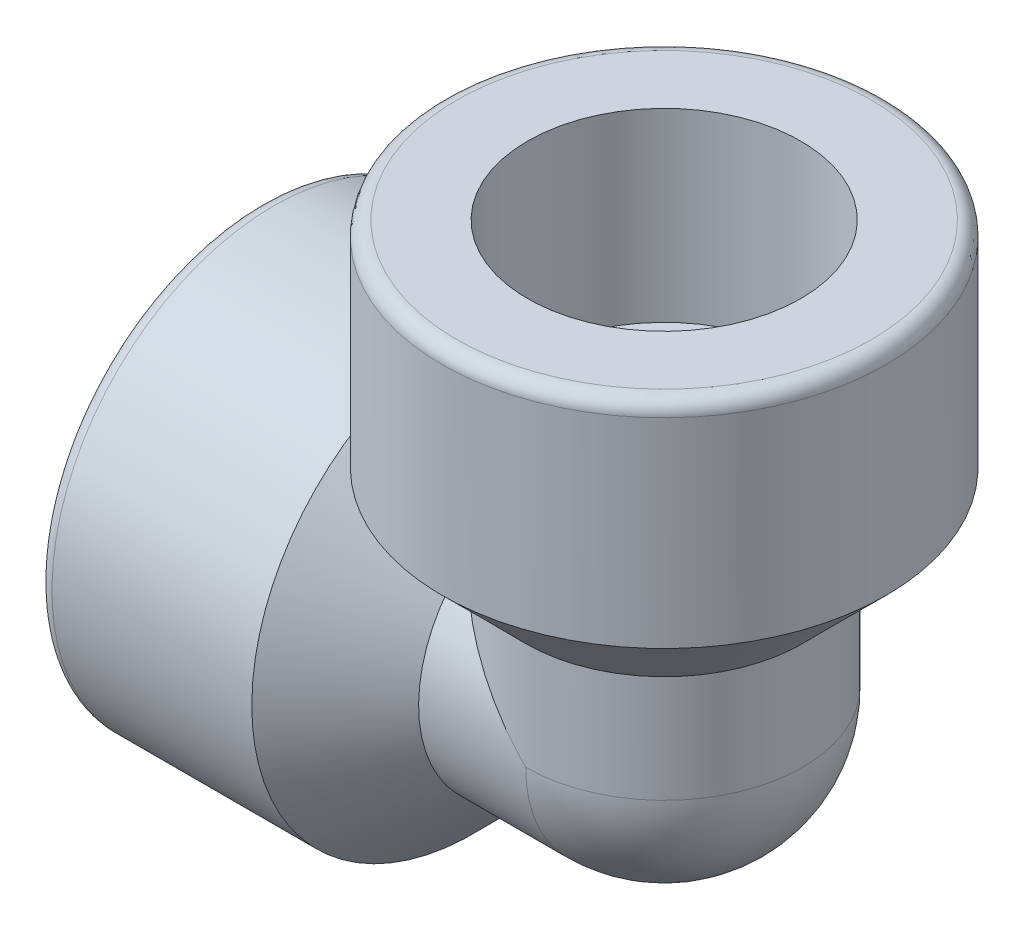
ISO-10303-21;
HEADER;
FILE_DESCRIPTION(('STEP AP214'),'2;1');
FILE_NAME('part.step','',(''),(''),'','','');
FILE_SCHEMA(('AUTOMOTIVE_DESIGN { 1 0 10303 214 1 1 1 1 }'));
ENDSEC;
DATA;
#1=APPLICATION_CONTEXT('core data for automotive mechanical design processes');
#2=APPLICATION_PROTOCOL_DEFINITION('international standard','automotive_design',2000,#1);
#3=PRODUCT_CONTEXT('',#1,'mechanical');
#4=PRODUCT('Part','Part','',(#3));
#5=PRODUCT_RELATED_PRODUCT_CATEGORY('part','',(#4));
#6=PRODUCT_DEFINITION_FORMATION('','',#4);
#7=PRODUCT_DEFINITION_CONTEXT('part definition',#1,'design');
#8=PRODUCT_DEFINITION('design','',#6,#7);
#9=PRODUCT_DEFINITION_SHAPE('','',#8);
#10=(LENGTH_UNIT() NAMED_UNIT(*) SI_UNIT(.MILLI.,.METRE.));
#11=(NAMED_UNIT(*) PLANE_ANGLE_UNIT() SI_UNIT($,.RADIAN.));
#12=(NAMED_UNIT(*) SI_UNIT($,.STERADIAN.) SOLID_ANGLE_UNIT());
#13=UNCERTAINTY_MEASURE_WITH_UNIT(LENGTH_MEASURE(1.E-05),#10,'distance_accuracy_value','');
#14=(GEOMETRIC_REPRESENTATION_CONTEXT(3) GLOBAL_UNCERTAINTY_ASSIGNED_CONTEXT((#13)) GLOBAL_UNIT_ASSIGNED_CONTEXT((#10,
#11,#12)) REPRESENTATION_CONTEXT('',''));
#15=CARTESIAN_POINT('',(0.,0.,0.));
#16=DIRECTION('',(0.,0.,1.));
#17=DIRECTION('',(1.,0.,0.));
#18=AXIS2_PLACEMENT_3D('',#15,#16,#17);
#19=CARTESIAN_POINT('',(0.,0.,0.));
#20=DIRECTION('',(1.,0.,0.));
#21=DIRECTION('',(0.,1.,0.));
#22=AXIS2_PLACEMENT_3D('',#19,#20,#21);
#23=CYLINDRICAL_SURFACE('',#22,11.557);
#24=CARTESIAN_POINT('',(-20.32635,0.,0.));
#25=DIRECTION('',(1.,0.,0.));
#26=DIRECTION('',(0.,1.,0.));
#27=AXIS2_PLACEMENT_3D('',#24,#25,#26);
#28=CIRCLE('',#27,11.557);
#29=CARTESIAN_POINT('',(-20.32635,11.557,0.));
#30=VERTEX_POINT('',#29);
#31=EDGE_CURVE('E228',#30,#30,#28,.T.);
#32=ORIENTED_EDGE('',*,*,#31,.T.);
#33=EDGE_LOOP('',(#32));
#34=FACE_BOUND('',#33,.T.);
#35=CARTESIAN_POINT('',(0.,0.,0.));
#36=DIRECTION('',(0.707106781186549,0.707106781186546,0.));
#37=DIRECTION('',(0.707106781186546,-0.707106781186549,0.));
#38=AXIS2_PLACEMENT_3D('',#35,#36,#37);
#39=ELLIPSE('',#38,16.3440661403458,11.557);
#40=CARTESIAN_POINT('',(-9.9187,9.91870000000003,-5.9315798325572));
#41=VERTEX_POINT('',#40);
#42=CARTESIAN_POINT('',(-9.9187,9.91870000000003,5.93157983255719));
#43=VERTEX_POINT('',#42);
#44=EDGE_CURVE('E89',#41,#43,#39,.T.);
#45=ORIENTED_EDGE('',*,*,#44,.F.);
#46=CARTESIAN_POINT('',(-9.9187,0.,0.));
#47=DIRECTION('',(1.,0.,0.));
#48=DIRECTION('',(0.,1.,0.));
#49=AXIS2_PLACEMENT_3D('',#46,#47,#48);
#50=CIRCLE('',#49,11.557);
#51=EDGE_CURVE('E231',#43,#41,#50,.T.);
#52=ORIENTED_EDGE('',*,*,#51,.F.);
#53=EDGE_LOOP('',(#45,#52));
#54=FACE_BOUND('',#53,.T.);
#55=ADVANCED_FACE('F75',(#34,#54),#23,.T.);
#56=CARTESIAN_POINT('',(-9.9187,0.,0.));
#57=DIRECTION('',(-1.,0.,0.));
#58=DIRECTION('',(0.,-1.,0.));
#59=AXIS2_PLACEMENT_3D('',#56,#57,#58);
#60=CONICAL_SURFACE('',#59,11.557,0.78539816339745);
#61=CARTESIAN_POINT('',(0.819150000016464,-0.819150000016481,-3.67419835772198E-06));
#62=CARTESIAN_POINT('',(0.819156269639418,-0.819156269637033,-0.0297198111189538));
#63=CARTESIAN_POINT('',(0.818341564804103,-0.818341564801315,-0.0594315481141546));
#64=CARTESIAN_POINT('',(0.815118347324884,-0.815118347322729,-0.118664130948054));
#65=CARTESIAN_POINT('',(0.812710803606909,-0.812710803605789,-0.148185081825391));
#66=CARTESIAN_POINT('',(0.806369467932354,-0.806369467932181,-0.206710310389112));
#67=CARTESIAN_POINT('',(0.802445137013405,-0.802445137013152,-0.235716647432656));
#68=CARTESIAN_POINT('',(0.793155421370217,-0.793155421369958,-0.293261594975939));
#69=CARTESIAN_POINT('',(0.78778987559809,-0.787789875597907,-0.321800152825533));
#70=CARTESIAN_POINT('',(0.770015622419365,-0.770015622419321,-0.40497565493601));
#71=CARTESIAN_POINT('',(0.755738389208463,-0.755738389208404,-0.458828652506281));
#72=CARTESIAN_POINT('',(0.722943675232962,-0.722943675232901,-0.563916811210308));
#73=CARTESIAN_POINT('',(0.704420012077311,-0.70442001207726,-0.615148020925281));
#74=CARTESIAN_POINT('',(0.665053367432766,-0.665053367432733,-0.712135568869142));
#75=CARTESIAN_POINT('',(0.644388588003857,-0.644388588003829,-0.758038171101275));
#76=CARTESIAN_POINT('',(0.60060805616887,-0.600608056168854,-0.847388735807518));
#77=CARTESIAN_POINT('',(0.577493278068745,-0.577493278068735,-0.890837663591248));
#78=CARTESIAN_POINT('',(0.504857186094345,-0.504857186094345,-1.01838017300757));
#79=CARTESIAN_POINT('',(0.452316126920789,-0.452316126920786,-1.09903670569827));
#80=CARTESIAN_POINT('',(0.34592139389584,-0.345921393895837,-1.24726431852031));
#81=CARTESIAN_POINT('',(0.292419689578086,-0.292419689578086,-1.31535670015542));
#82=CARTESIAN_POINT('',(0.182353106905065,-0.182353106905066,-1.44595214154866));
#83=CARTESIAN_POINT('',(0.125796122300498,-0.125796122300498,-1.50846859356285));
#84=CARTESIAN_POINT('',(0.00952008937551708,-0.00952008937551695,-1.62989947045198));
#85=CARTESIAN_POINT('',(-0.0502331046806778,0.0502331046806761,-1.68874785277483));
#86=CARTESIAN_POINT('',(-0.171551622961965,0.171551622961963,-1.80259962860101));
#87=CARTESIAN_POINT('',(-0.233117371607717,0.233117371607715,-1.85760211122277));
#88=CARTESIAN_POINT('',(-0.40948889915928,0.409488899159279,-2.00882392423893));
#89=CARTESIAN_POINT('',(-0.525931963692403,0.525931963692401,-2.1012195871446));
#90=CARTESIAN_POINT('',(-0.76129211758488,0.761292117584877,-2.27731269671302));
#91=CARTESIAN_POINT('',(-0.880194609565693,0.88019460956569,-2.36104985124859));
#92=CARTESIAN_POINT('',(-1.12239979641724,1.12239979641724,-2.52357003142706));
#93=CARTESIAN_POINT('',(-1.24574319585185,1.24574319585185,-2.60223109558595));
#94=CARTESIAN_POINT('',(-1.49426297891656,1.49426297891657,-2.75425245647894));
#95=CARTESIAN_POINT('',(-1.61944185711383,1.61944185711384,-2.82760453935986));
#96=CARTESIAN_POINT('',(-1.87036579396111,1.87036579396111,-2.96942187330136));
#97=CARTESIAN_POINT('',(-1.99610385663772,1.99610385663772,-3.03791198237221));
#98=CARTESIAN_POINT('',(-2.24857214089893,2.24857214089893,-3.17113933885167));
#99=CARTESIAN_POINT('',(-2.37530240672953,2.37530240672953,-3.23587641780437));
#100=CARTESIAN_POINT('',(-2.75673574200862,2.75673574200863,-3.42531229711047));
#101=CARTESIAN_POINT('',(-3.01263225618365,3.01263225618366,-3.54520854622947));
#102=CARTESIAN_POINT('',(-3.52662595753384,3.52662595753385,-3.77525417597969));
#103=CARTESIAN_POINT('',(-3.78472350373364,3.78472350373365,-3.8854019317908));
#104=CARTESIAN_POINT('',(-4.30252125377587,4.30252125377588,-4.0979206819409));
#105=CARTESIAN_POINT('',(-4.56222153228517,4.56222153228518,-4.20029131096249));
#106=CARTESIAN_POINT('',(-5.08137651785985,5.08137651785986,-4.39811172027716));
#107=CARTESIAN_POINT('',(-5.34082450501243,5.34082450501244,-4.49359694031685));
#108=CARTESIAN_POINT('',(-5.86066706418759,5.8606670641876,-4.679282766519));
#109=CARTESIAN_POINT('',(-6.12106166022858,6.1210616602286,-4.76948323758284));
#110=CARTESIAN_POINT('',(-6.90321487450145,6.90321487450147,-5.03330470259219));
#111=CARTESIAN_POINT('',(-7.42611015403457,7.42611015403458,-5.20020826852687));
#112=CARTESIAN_POINT('',(-8.09741799716953,8.09741799716955,-5.40537001663242));
#113=CARTESIAN_POINT('',(-8.24489750306851,8.24489750306854,-5.44988004888537));
#114=CARTESIAN_POINT('',(-8.54009456655671,8.54009456655673,-5.53790942822333));
#115=CARTESIAN_POINT('',(-8.68781221271166,8.68781221271168,-5.5814281840529));
#116=CARTESIAN_POINT('',(-9.54530318441663,9.54530318441666,-5.83121141271593));
#117=CARTESIAN_POINT('',(-10.2565902471213,10.2565902471213,-6.02712267853347));
#118=CARTESIAN_POINT('',(-11.6813417291102,11.6813417291103,-6.40267069692991));
#119=CARTESIAN_POINT('',(-12.3948063247732,12.3948063247732,-6.58230609295505));
#120=CARTESIAN_POINT('',(-13.8210993159182,13.8210993159183,-6.92821499503416));
#121=CARTESIAN_POINT('',(-14.5339229813901,14.5339229813901,-7.09452769389603));
#122=CARTESIAN_POINT('',(-15.9606306986241,15.9606306986242,-7.41660654573186));
#123=CARTESIAN_POINT('',(-16.6745145342454,16.6745145342454,-7.57237460900595));
#124=CARTESIAN_POINT('',(-17.388818637976,17.3888186379761,-7.72400349813519));
#125=B_SPLINE_CURVE_WITH_KNOTS('',3,(#61,#62,#63,#64,#65,#66,#67,#68,#69,#70,#71,#72,#73,#74,
#75,#76,#77,#78,#79,#80,#81,#82,#83,#84,#85,#86,#87,#88,#89,#90,#91,#92,#93,#94,#95,#96,#97,#98,
#99,#100,#101,#102,#103,#104,#105,#106,#107,#108,#109,#110,#111,#112,#113,#114,#115,#116,#117,
#118,#119,#120,#121,#122,#123,#124),.UNSPECIFIED.,.F.,.F.,(4,2,2,2,2,2,2,2,2,2,2,2,2,2,2,2,2,2,
2,2,2,2,2,2,2,2,2,2,2,2,2,4),(0.,0.0891189353022934,0.178183709224776,0.266701676384099,
0.355229539060664,0.527292916655194,0.699608410971924,0.862661040903622,1.0256490702678,
1.35382697338063,1.6589328352987,1.96328496632865,2.27208775532645,2.58096343666127,
3.1470816044846,3.71047622719119,4.28440892313418,4.85921140124149,5.43082435770936,
6.00246295136562,7.14596368571146,8.28965465434297,9.43339931275442,10.5707601215204,
11.7081499929495,13.982196056795,14.6219886402474,15.2621533375249,18.3363762022616,
21.4108550606683,24.4759291581247,27.5404464825768),.UNSPECIFIED.);
#126=CARTESIAN_POINT('',(-5.57530000000001,5.57530000000002,-4.57734146312023));
#127=VERTEX_POINT('',#126);
#128=EDGE_CURVE('E161',#127,#41,#125,.T.);
#129=ORIENTED_EDGE('',*,*,#128,.F.);
#130=CARTESIAN_POINT('',(-5.57530000000001,0.,0.));
#131=DIRECTION('',(1.,0.,0.));
#132=DIRECTION('',(0.,1.,0.));
#133=AXIS2_PLACEMENT_3D('',#130,#131,#132);
#134=CIRCLE('',#133,7.2136);
#135=CARTESIAN_POINT('',(-5.57530000000001,5.57530000000002,4.57734146312023));
#136=VERTEX_POINT('',#135);
#137=EDGE_CURVE('E134',#136,#127,#134,.T.);
#138=ORIENTED_EDGE('',*,*,#137,.F.);
#139=CARTESIAN_POINT('',(-16.0467236926674,16.0467236926675,7.43389008133731));
#140=CARTESIAN_POINT('',(-15.4158659754983,15.4158659754983,7.2947674773493));
#141=CARTESIAN_POINT('',(-14.7853953081274,14.7853953081274,7.15200573804484));
#142=CARTESIAN_POINT('',(-13.5254826259591,13.5254826259591,6.85738228857209));
#143=CARTESIAN_POINT('',(-12.8960406730512,12.8960406730512,6.70552005020596));
#144=CARTESIAN_POINT('',(-11.5709177346487,11.5709177346487,6.37397738287092));
#145=CARTESIAN_POINT('',(-10.8753904278125,10.8753904278125,6.19306148341086));
#146=CARTESIAN_POINT('',(-9.48658913164779,9.48658913164782,5.81411270705077));
#147=CARTESIAN_POINT('',(-8.79331530479206,8.79331530479209,5.61607862316274));
#148=CARTESIAN_POINT('',(-7.76918265209869,7.76918265209872,5.30571266161461));
#149=CARTESIAN_POINT('',(-7.43697980018853,7.43697980018856,5.20224682579303));
#150=CARTESIAN_POINT('',(-6.77359741677388,6.7735974167739,4.98896812587615));
#151=CARTESIAN_POINT('',(-6.44241786346557,6.44241786346559,4.87915539801272));
#152=CARTESIAN_POINT('',(-5.78141206171462,5.78141206171463,4.65191536155329));
#153=CARTESIAN_POINT('',(-5.45158562343978,5.45158562343979,4.53448916282331));
#154=CARTESIAN_POINT('',(-4.79373190953684,4.79373190953686,4.29023306572654));
#155=CARTESIAN_POINT('',(-4.46570432412057,4.46570432412058,4.16340484486831));
#156=CARTESIAN_POINT('',(-3.83430549851432,3.83430549851433,3.90677518033253));
#157=CARTESIAN_POINT('',(-3.53077560158462,3.53077560158463,3.77776355966065));
#158=CARTESIAN_POINT('',(-3.07768398647884,3.07768398647885,3.57392647165347));
#159=CARTESIAN_POINT('',(-2.92696700516343,2.92696700516344,3.5042339898758));
#160=CARTESIAN_POINT('',(-2.62649531170128,2.62649531170129,3.3608265937967));
#161=CARTESIAN_POINT('',(-2.47674056214819,2.4767405621482,3.28711183692997));
#162=CARTESIAN_POINT('',(-2.17770767410717,2.17770767410718,3.13454199198876));
#163=CARTESIAN_POINT('',(-2.02843551212798,2.02843551212798,3.05566338300983));
#164=CARTESIAN_POINT('',(-1.73150150746308,1.73150150746308,2.89208634719591));
#165=CARTESIAN_POINT('',(-1.58383949583769,1.58383949583769,2.80738853786347));
#166=CARTESIAN_POINT('',(-1.29081141706042,1.29081141706042,2.6308345101825));
#167=CARTESIAN_POINT('',(-1.14544346116887,1.14544346116887,2.5389845946275));
#168=CARTESIAN_POINT('',(-0.857809686605636,0.857809686605634,2.34607692489336));
#169=CARTESIAN_POINT('',(-0.715542679563085,0.715542679563083,2.24502277775303));
#170=CARTESIAN_POINT('',(-0.500496320398371,0.500496320398371,2.08020198777034));
#171=CARTESIAN_POINT('',(-0.426035135944628,0.42603513594463,2.02082806271226));
#172=CARTESIAN_POINT('',(-0.278956851800557,0.278956851800558,1.89785297153267));
#173=CARTESIAN_POINT('',(-0.206338113655694,0.206338113655692,1.83425575722865));
#174=CARTESIAN_POINT('',(-0.0646927160790194,0.0646927160790173,1.70300703051303));
#175=CARTESIAN_POINT('',(0.00437393228517486,-0.00437393228517498,1.6354423277687));
#176=CARTESIAN_POINT('',(0.139312572045511,-0.13931257204551,1.49417444818114));
#177=CARTESIAN_POINT('',(0.205185746611125,-0.205185746611124,1.42047357269587));
#178=CARTESIAN_POINT('',(0.303187111698328,-0.303187111698326,1.30090765077394));
#179=CARTESIAN_POINT('',(0.336961300478641,-0.336961300478638,1.25774072891856));
#180=CARTESIAN_POINT('',(0.402788029686768,-0.402788029686765,1.16885817662069));
#181=CARTESIAN_POINT('',(0.434840949493105,-0.434840949493101,1.12314311236928));
#182=CARTESIAN_POINT('',(0.496492983336969,-0.496492983336958,1.02927186169264));
#183=CARTESIAN_POINT('',(0.526111860816893,-0.526111860816876,0.981141829559768));
#184=CARTESIAN_POINT('',(0.582642764454361,-0.582642764454338,0.881709949505528));
#185=CARTESIAN_POINT('',(0.609552696063494,-0.609552696063472,0.830405696025137));
#186=CARTESIAN_POINT('',(0.661511821880377,-0.661511821880346,0.720909885490046));
#187=CARTESIAN_POINT('',(0.686320753406973,-0.686320753406931,0.662487242839695));
#188=CARTESIAN_POINT('',(0.730652514622214,-0.730652514622171,0.541837641346437));
#189=CARTESIAN_POINT('',(0.750188296336073,-0.750188296336039,0.479620472627038));
#190=CARTESIAN_POINT('',(0.774807626126006,-0.774807626125868,0.382612302394498));
#191=CARTESIAN_POINT('',(0.782320963825162,-0.782320963824967,0.349038241946078));
#192=CARTESIAN_POINT('',(0.795380463290395,-0.795380463290217,0.281132027239059));
#193=CARTESIAN_POINT('',(0.800927080496336,-0.800927080496231,0.246800050452344));
#194=CARTESIAN_POINT('',(0.809935520516454,-0.809935520515707,0.177231575886932));
#195=CARTESIAN_POINT('',(0.813375784912049,-0.813375784910579,0.141989450810301));
#196=CARTESIAN_POINT('',(0.817990699551,-0.817990699549078,0.0711695089127556));
#197=CARTESIAN_POINT('',(0.819162675493323,-0.819162675491671,0.035591345481499));
#198=CARTESIAN_POINT('',(0.819150000010504,-0.819150000010521,2.93563873496511E-06));
#199=B_SPLINE_CURVE_WITH_KNOTS('',3,(#139,#140,#141,#142,#143,#144,#145,#146,#147,#148,#149,
#150,#151,#152,#153,#154,#155,#156,#157,#158,#159,#160,#161,#162,#163,#164,#165,#166,#167,#168,
#169,#170,#171,#172,#173,#174,#175,#176,#177,#178,#179,#180,#181,#182,#183,#184,#185,#186,#187,
#188,#189,#190,#191,#192,#193,#194,#195,#196,#197,#198),.UNSPECIFIED.,.F.,.F.,(4,2,2,2,2,2,2,2,
2,2,2,2,2,2,2,2,2,2,2,2,2,2,2,2,2,2,2,2,2,4),(0.,2.70887116468708,5.41789970627266,
8.41816395385601,11.4186399202379,12.8617980673313,14.3049252494783,15.7478425283824,
17.1905029787808,18.5349776418694,19.2076975899197,19.880391226095,20.5563967767829,
21.2323307038258,21.9076755626822,22.5827568906604,22.945348067042,23.3076046142722,
23.6637315515863,24.0197255208061,24.2127896791964,24.4058111088926,24.5970669434371,
24.7884695385411,24.9925129899604,25.196050608156,25.3015969419512,25.4071188180513,
25.5137033996035,25.6204135674921),.UNSPECIFIED.);
#200=EDGE_CURVE('E96',#43,#136,#199,.T.);
#201=ORIENTED_EDGE('',*,*,#200,.F.);
#202=ORIENTED_EDGE('',*,*,#51,.T.);
#203=EDGE_LOOP('',(#129,#138,#201,#202));
#204=FACE_BOUND('',#203,.T.);
#205=ADVANCED_FACE('F167',(#204),#60,.T.);
#206=CARTESIAN_POINT('',(0.,0.,0.));
#207=DIRECTION('',(1.,0.,0.));
#208=DIRECTION('',(0.,1.,0.));
#209=AXIS2_PLACEMENT_3D('',#206,#207,#208);
#210=CYLINDRICAL_SURFACE('',#209,7.2136);
#211=CARTESIAN_POINT('',(0.,0.,0.));
#212=DIRECTION('',(0.707106781186549,0.707106781186546,0.));
#213=DIRECTION('',(0.707106781186546,-0.707106781186549,0.));
#214=AXIS2_PLACEMENT_3D('',#211,#212,#213);
#215=ELLIPSE('',#214,10.2015709535345,7.2136);
#216=CARTESIAN_POINT('',(0.,0.,-7.2136));
#217=VERTEX_POINT('',#216);
#218=EDGE_CURVE('E128',#217,#127,#215,.T.);
#219=ORIENTED_EDGE('',*,*,#218,.F.);
#220=CARTESIAN_POINT('',(0.,0.,0.));
#221=DIRECTION('',(1.,0.,0.));
#222=DIRECTION('',(0.,1.,0.));
#223=AXIS2_PLACEMENT_3D('',#220,#221,#222);
#224=CIRCLE('',#223,7.2136);
#225=CARTESIAN_POINT('',(0.,0.,7.2136));
#226=VERTEX_POINT('',#225);
#227=EDGE_CURVE('E131',#226,#217,#224,.T.);
#228=ORIENTED_EDGE('',*,*,#227,.F.);
#229=EDGE_CURVE('E117',#136,#226,#215,.T.);
#230=ORIENTED_EDGE('',*,*,#229,.F.);
#231=ORIENTED_EDGE('',*,*,#137,.T.);
#232=EDGE_LOOP('',(#219,#228,#230,#231));
#233=FACE_BOUND('',#232,.T.);
#234=ADVANCED_FACE('F132',(#233),#210,.T.);
#235=CARTESIAN_POINT('',(-21.082,-7.112,0.));
#236=DIRECTION('',(1.,0.,0.));
#237=DIRECTION('',(0.,1.,0.));
#238=AXIS2_PLACEMENT_3D('',#235,#236,#237);
#239=PLANE('',#238);
#240=CARTESIAN_POINT('',(-21.082,0.,0.));
#241=DIRECTION('',(1.,0.,0.));
#242=DIRECTION('',(0.,1.,0.));
#243=AXIS2_PLACEMENT_3D('',#240,#241,#242);
#244=CIRCLE('',#243,10.80135);
#245=CARTESIAN_POINT('',(-21.082,10.80135,0.));
#246=VERTEX_POINT('',#245);
#247=EDGE_CURVE('E83',#246,#246,#244,.T.);
#248=ORIENTED_EDGE('',*,*,#247,.F.);
#249=EDGE_LOOP('',(#248));
#250=FACE_BOUND('',#249,.T.);
#251=CARTESIAN_POINT('',(-21.082,0.,0.));
#252=DIRECTION('',(1.,0.,0.));
#253=DIRECTION('',(0.,1.,0.));
#254=AXIS2_PLACEMENT_3D('',#251,#252,#253);
#255=CIRCLE('',#254,7.112);
#256=CARTESIAN_POINT('',(-21.082,7.112,0.));
#257=VERTEX_POINT('',#256);
#258=EDGE_CURVE('E244',#257,#257,#255,.T.);
#259=ORIENTED_EDGE('',*,*,#258,.T.);
#260=EDGE_LOOP('',(#259));
#261=FACE_BOUND('',#260,.T.);
#262=ADVANCED_FACE('F77',(#250,#261),#239,.F.);
#263=CARTESIAN_POINT('',(-20.32635,0.,0.));
#264=DIRECTION('',(1.,0.,0.));
#265=DIRECTION('',(0.,1.,0.));
#266=AXIS2_PLACEMENT_3D('',#263,#264,#265);
#267=TOROIDAL_SURFACE('',#266,10.80135,0.755650000000001);
#268=ORIENTED_EDGE('',*,*,#31,.F.);
#269=EDGE_LOOP('',(#268));
#270=FACE_BOUND('',#269,.T.);
#271=ORIENTED_EDGE('',*,*,#247,.T.);
#272=EDGE_LOOP('',(#271));
#273=FACE_BOUND('',#272,.T.);
#274=ADVANCED_FACE('F206',(#270,#273),#267,.T.);
#275=CARTESIAN_POINT('',(0.,0.,0.));
#276=DIRECTION('',(1.,0.,0.));
#277=DIRECTION('',(0.,1.,0.));
#278=AXIS2_PLACEMENT_3D('',#275,#276,#277);
#279=CYLINDRICAL_SURFACE('',#278,4.191);
#280=CARTESIAN_POINT('',(0.,0.,0.));
#281=DIRECTION('',(0.707106781186549,0.707106781186546,0.));
#282=DIRECTION('',(0.707106781186546,-0.707106781186549,0.));
#283=AXIS2_PLACEMENT_3D('',#280,#281,#282);
#284=ELLIPSE('',#283,5.92696903990563,4.191);
#285=CARTESIAN_POINT('',(0.,0.,-4.191));
#286=VERTEX_POINT('',#285);
#287=CARTESIAN_POINT('',(0.,0.,4.191));
#288=VERTEX_POINT('',#287);
#289=EDGE_CURVE('E12',#286,#288,#284,.T.);
#290=ORIENTED_EDGE('',*,*,#289,.T.);
#291=CARTESIAN_POINT('',(0.,0.,0.));
#292=DIRECTION('',(1.,0.,0.));
#293=DIRECTION('',(0.,1.,0.));
#294=AXIS2_PLACEMENT_3D('',#291,#292,#293);
#295=CIRCLE('',#294,4.191);
#296=EDGE_CURVE('E135',#288,#286,#295,.T.);
#297=ORIENTED_EDGE('',*,*,#296,.T.);
#298=EDGE_LOOP('',(#290,#297));
#299=FACE_BOUND('',#298,.T.);
#300=CARTESIAN_POINT('',(-11.43,0.,0.));
#301=DIRECTION('',(1.,0.,0.));
#302=DIRECTION('',(0.,1.,0.));
#303=AXIS2_PLACEMENT_3D('',#300,#301,#302);
#304=CIRCLE('',#303,4.191);
#305=CARTESIAN_POINT('',(-11.43,4.19099999999999,0.));
#306=VERTEX_POINT('',#305);
#307=EDGE_CURVE('E238',#306,#306,#304,.T.);
#308=ORIENTED_EDGE('',*,*,#307,.F.);
#309=EDGE_LOOP('',(#308));
#310=FACE_BOUND('',#309,.T.);
#311=ADVANCED_FACE('F203',(#299,#310),#279,.F.);
#312=CARTESIAN_POINT('',(-11.43,-7.112,0.));
#313=DIRECTION('',(1.,0.,0.));
#314=DIRECTION('',(0.,1.,0.));
#315=AXIS2_PLACEMENT_3D('',#312,#313,#314);
#316=PLANE('',#315);
#317=CARTESIAN_POINT('',(-11.43,0.,0.));
#318=DIRECTION('',(1.,0.,0.));
#319=DIRECTION('',(0.,1.,0.));
#320=AXIS2_PLACEMENT_3D('',#317,#318,#319);
#321=CIRCLE('',#320,7.112);
#322=CARTESIAN_POINT('',(-11.43,7.11199999999999,0.));
#323=VERTEX_POINT('',#322);
#324=EDGE_CURVE('E241',#323,#323,#321,.T.);
#325=ORIENTED_EDGE('',*,*,#324,.F.);
#326=EDGE_LOOP('',(#325));
#327=FACE_BOUND('',#326,.T.);
#328=ORIENTED_EDGE('',*,*,#307,.T.);
#329=EDGE_LOOP('',(#328));
#330=FACE_BOUND('',#329,.T.);
#331=ADVANCED_FACE('F199',(#327,#330),#316,.F.);
#332=CARTESIAN_POINT('',(0.,0.,0.));
#333=DIRECTION('',(1.,0.,0.));
#334=DIRECTION('',(0.,1.,0.));
#335=AXIS2_PLACEMENT_3D('',#332,#333,#334);
#336=CYLINDRICAL_SURFACE('',#335,7.112);
#337=ORIENTED_EDGE('',*,*,#258,.F.);
#338=EDGE_LOOP('',(#337));
#339=FACE_BOUND('',#338,.T.);
#340=ORIENTED_EDGE('',*,*,#324,.T.);
#341=EDGE_LOOP('',(#340));
#342=FACE_BOUND('',#341,.T.);
#343=ADVANCED_FACE('F195',(#339,#342),#336,.F.);
#344=CARTESIAN_POINT('',(0.,21.082,0.));
#345=DIRECTION('',(0.,-1.,0.));
#346=DIRECTION('',(1.,0.,0.));
#347=AXIS2_PLACEMENT_3D('',#344,#345,#346);
#348=CYLINDRICAL_SURFACE('',#347,4.191);
#349=ORIENTED_EDGE('',*,*,#289,.F.);
#350=CARTESIAN_POINT('',(0.,0.,0.));
#351=DIRECTION('',(0.,-1.,0.));
#352=DIRECTION('',(1.,0.,0.));
#353=AXIS2_PLACEMENT_3D('',#350,#351,#352);
#354=CIRCLE('',#353,4.191);
#355=EDGE_CURVE('E138',#286,#288,#354,.T.);
#356=ORIENTED_EDGE('',*,*,#355,.T.);
#357=EDGE_LOOP('',(#349,#356));
#358=FACE_BOUND('',#357,.T.);
#359=CARTESIAN_POINT('',(0.,11.43,0.));
#360=DIRECTION('',(0.,-1.,0.));
#361=DIRECTION('',(1.,0.,0.));
#362=AXIS2_PLACEMENT_3D('',#359,#360,#361);
#363=CIRCLE('',#362,4.191);
#364=CARTESIAN_POINT('',(4.19100000000003,11.43,0.));
#365=VERTEX_POINT('',#364);
#366=EDGE_CURVE('E143',#365,#365,#363,.T.);
#367=ORIENTED_EDGE('',*,*,#366,.F.);
#368=EDGE_LOOP('',(#367));
#369=FACE_BOUND('',#368,.T.);
#370=ADVANCED_FACE('F182',(#358,#369),#348,.F.);
#371=CARTESIAN_POINT('',(0.,0.,0.));
#372=DIRECTION('',(0.,-1.,0.));
#373=DIRECTION('',(1.,0.,0.));
#374=AXIS2_PLACEMENT_3D('',#371,#372,#373);
#375=CYLINDRICAL_SURFACE('',#374,11.557);
#376=CARTESIAN_POINT('',(0.,20.32635,0.));
#377=DIRECTION('',(0.,-1.,0.));
#378=DIRECTION('',(1.,0.,0.));
#379=AXIS2_PLACEMENT_3D('',#376,#377,#378);
#380=CIRCLE('',#379,11.557);
#381=CARTESIAN_POINT('',(11.5570000000001,20.32635,0.));
#382=VERTEX_POINT('',#381);
#383=EDGE_CURVE('E149',#382,#382,#380,.T.);
#384=ORIENTED_EDGE('',*,*,#383,.T.);
#385=EDGE_LOOP('',(#384));
#386=FACE_BOUND('',#385,.T.);
#387=CARTESIAN_POINT('',(0.,9.9187,0.));
#388=DIRECTION('',(0.,-1.,0.));
#389=DIRECTION('',(1.,0.,0.));
#390=AXIS2_PLACEMENT_3D('',#387,#388,#389);
#391=CIRCLE('',#390,11.557);
#392=EDGE_CURVE('E140',#41,#43,#391,.T.);
#393=ORIENTED_EDGE('',*,*,#392,.F.);
#394=ORIENTED_EDGE('',*,*,#44,.T.);
#395=EDGE_LOOP('',(#393,#394));
#396=FACE_BOUND('',#395,.T.);
#397=ADVANCED_FACE('F176',(#386,#396),#375,.T.);
#398=CARTESIAN_POINT('',(0.,9.9187,0.));
#399=DIRECTION('',(0.,1.,0.));
#400=DIRECTION('',(-1.,0.,0.));
#401=AXIS2_PLACEMENT_3D('',#398,#399,#400);
#402=CONICAL_SURFACE('',#401,11.557,0.78539816339745);
#403=CARTESIAN_POINT('',(0.,5.57530000000001,0.));
#404=DIRECTION('',(0.,-1.,0.));
#405=DIRECTION('',(1.,0.,0.));
#406=AXIS2_PLACEMENT_3D('',#403,#404,#405);
#407=CIRCLE('',#406,7.2136);
#408=EDGE_CURVE('E125',#127,#136,#407,.T.);
#409=ORIENTED_EDGE('',*,*,#408,.F.);
#410=ORIENTED_EDGE('',*,*,#128,.T.);
#411=ORIENTED_EDGE('',*,*,#392,.T.);
#412=ORIENTED_EDGE('',*,*,#200,.T.);
#413=EDGE_LOOP('',(#409,#410,#411,#412));
#414=FACE_BOUND('',#413,.T.);
#415=ADVANCED_FACE('F171',(#414),#402,.T.);
#416=CARTESIAN_POINT('',(0.,0.,0.));
#417=DIRECTION('',(0.,-1.,0.));
#418=DIRECTION('',(1.,0.,0.));
#419=AXIS2_PLACEMENT_3D('',#416,#417,#418);
#420=CYLINDRICAL_SURFACE('',#419,7.2136);
#421=CARTESIAN_POINT('',(0.,0.,0.));
#422=DIRECTION('',(0.,-1.,0.));
#423=DIRECTION('',(1.,0.,0.));
#424=AXIS2_PLACEMENT_3D('',#421,#422,#423);
#425=CIRCLE('',#424,7.2136);
#426=EDGE_CURVE('E122',#217,#226,#425,.T.);
#427=ORIENTED_EDGE('',*,*,#426,.F.);
#428=ORIENTED_EDGE('',*,*,#218,.T.);
#429=ORIENTED_EDGE('',*,*,#408,.T.);
#430=ORIENTED_EDGE('',*,*,#229,.T.);
#431=EDGE_LOOP('',(#427,#428,#429,#430));
#432=FACE_BOUND('',#431,.T.);
#433=ADVANCED_FACE('F119',(#432),#420,.T.);
#434=CARTESIAN_POINT('',(-7.11199999999993,21.082,0.));
#435=DIRECTION('',(0.,-1.,0.));
#436=DIRECTION('',(1.,0.,0.));
#437=AXIS2_PLACEMENT_3D('',#434,#435,#436);
#438=PLANE('',#437);
#439=CARTESIAN_POINT('',(0.,21.082,0.));
#440=DIRECTION('',(0.,-1.,0.));
#441=DIRECTION('',(1.,0.,0.));
#442=AXIS2_PLACEMENT_3D('',#439,#440,#441);
#443=CIRCLE('',#442,10.80135);
#444=CARTESIAN_POINT('',(10.8013500000001,21.082,0.));
#445=VERTEX_POINT('',#444);
#446=EDGE_CURVE('E129',#445,#445,#443,.T.);
#447=ORIENTED_EDGE('',*,*,#446,.F.);
#448=EDGE_LOOP('',(#447));
#449=FACE_BOUND('',#448,.T.);
#450=CARTESIAN_POINT('',(0.,21.082,0.));
#451=DIRECTION('',(0.,-1.,0.));
#452=DIRECTION('',(1.,0.,0.));
#453=AXIS2_PLACEMENT_3D('',#450,#451,#452);
#454=CIRCLE('',#453,7.112);
#455=CARTESIAN_POINT('',(7.11200000000007,21.082,0.));
#456=VERTEX_POINT('',#455);
#457=EDGE_CURVE('E265',#456,#456,#454,.T.);
#458=ORIENTED_EDGE('',*,*,#457,.T.);
#459=EDGE_LOOP('',(#458));
#460=FACE_BOUND('',#459,.T.);
#461=ADVANCED_FACE('F188',(#449,#460),#438,.F.);
#462=CARTESIAN_POINT('',(0.,20.32635,0.));
#463=DIRECTION('',(0.,-1.,0.));
#464=DIRECTION('',(1.,0.,0.));
#465=AXIS2_PLACEMENT_3D('',#462,#463,#464);
#466=TOROIDAL_SURFACE('',#465,10.80135,0.755650000000001);
#467=ORIENTED_EDGE('',*,*,#383,.F.);
#468=EDGE_LOOP('',(#467));
#469=FACE_BOUND('',#468,.T.);
#470=ORIENTED_EDGE('',*,*,#446,.T.);
#471=EDGE_LOOP('',(#470));
#472=FACE_BOUND('',#471,.T.);
#473=ADVANCED_FACE('F184',(#469,#472),#466,.T.);
#474=CARTESIAN_POINT('',(-7.11199999999996,11.43,0.));
#475=DIRECTION('',(0.,-1.,0.));
#476=DIRECTION('',(1.,0.,0.));
#477=AXIS2_PLACEMENT_3D('',#474,#475,#476);
#478=PLANE('',#477);
#479=CARTESIAN_POINT('',(0.,11.43,0.));
#480=DIRECTION('',(0.,-1.,0.));
#481=DIRECTION('',(1.,0.,0.));
#482=AXIS2_PLACEMENT_3D('',#479,#480,#481);
#483=CIRCLE('',#482,7.112);
#484=CARTESIAN_POINT('',(7.11200000000003,11.43,0.));
#485=VERTEX_POINT('',#484);
#486=EDGE_CURVE('E263',#485,#485,#483,.T.);
#487=ORIENTED_EDGE('',*,*,#486,.F.);
#488=EDGE_LOOP('',(#487));
#489=FACE_BOUND('',#488,.T.);
#490=ORIENTED_EDGE('',*,*,#366,.T.);
#491=EDGE_LOOP('',(#490));
#492=FACE_BOUND('',#491,.T.);
#493=ADVANCED_FACE('F187',(#489,#492),#478,.F.);
#494=CARTESIAN_POINT('',(0.,0.,0.));
#495=DIRECTION('',(0.,-1.,0.));
#496=DIRECTION('',(1.,0.,0.));
#497=AXIS2_PLACEMENT_3D('',#494,#495,#496);
#498=CYLINDRICAL_SURFACE('',#497,7.112);
#499=ORIENTED_EDGE('',*,*,#457,.F.);
#500=EDGE_LOOP('',(#499));
#501=FACE_BOUND('',#500,.T.);
#502=ORIENTED_EDGE('',*,*,#486,.T.);
#503=EDGE_LOOP('',(#502));
#504=FACE_BOUND('',#503,.T.);
#505=ADVANCED_FACE('F272',(#501,#504),#498,.F.);
#506=CARTESIAN_POINT('',(0.,0.,0.));
#507=DIRECTION('',(0.,0.,-1.));
#508=DIRECTION('',(-1.,0.,0.));
#509=AXIS2_PLACEMENT_3D('',#506,#507,#508);
#510=SPHERICAL_SURFACE('',#509,7.2136);
#511=ORIENTED_EDGE('',*,*,#227,.T.);
#512=ORIENTED_EDGE('',*,*,#426,.T.);
#513=EDGE_LOOP('',(#511,#512));
#514=FACE_BOUND('',#513,.T.);
#515=ADVANCED_FACE('F137',(#514),#510,.T.);
#516=CARTESIAN_POINT('',(0.,0.,0.));
#517=DIRECTION('',(0.,0.,-1.));
#518=DIRECTION('',(-1.,0.,0.));
#519=AXIS2_PLACEMENT_3D('',#516,#517,#518);
#520=SPHERICAL_SURFACE('',#519,4.191);
#521=ORIENTED_EDGE('',*,*,#296,.F.);
#522=ORIENTED_EDGE('',*,*,#355,.F.);
#523=EDGE_LOOP('',(#521,#522));
#524=FACE_BOUND('',#523,.T.);
#525=ADVANCED_FACE('F258',(#524),#520,.F.);
#526=CLOSED_SHELL('',(#55,#205,#234,#262,#274,#311,#331,#343,#370,#397,#415,#433,#461,#473,#493,
#505,#515,#525));
#527=MANIFOLD_SOLID_BREP('B2',#526);
#528=ADVANCED_BREP_SHAPE_REPRESENTATION('',(#18,#527),#14);
#529=SHAPE_DEFINITION_REPRESENTATION(#9,#528);
ENDSEC;
END-ISO-10303-21;
